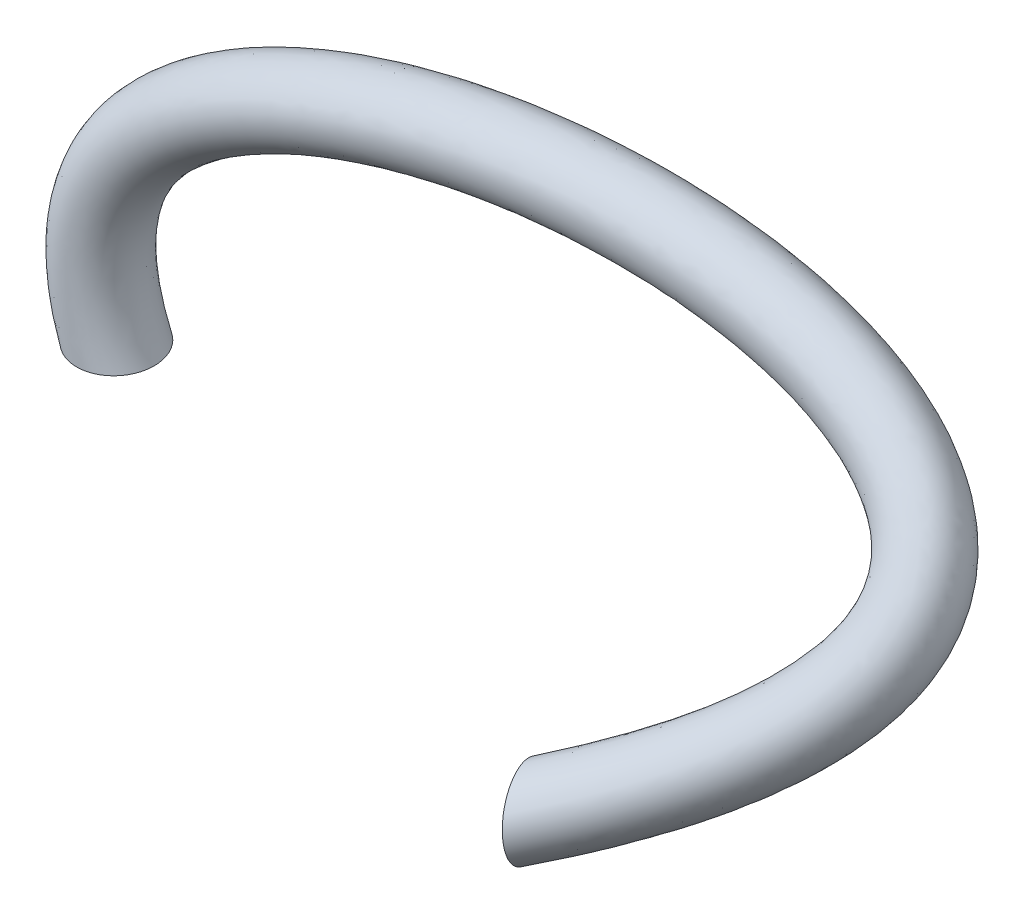
ISO-10303-21;
HEADER;
FILE_DESCRIPTION(('STEP AP214'),'2;1');
FILE_NAME('part.step','',(''),(''),'','','');
FILE_SCHEMA(('AUTOMOTIVE_DESIGN { 1 0 10303 214 1 1 1 1 }'));
ENDSEC;
DATA;
#1=APPLICATION_CONTEXT('core data for automotive mechanical design processes');
#2=APPLICATION_PROTOCOL_DEFINITION('international standard','automotive_design',2000,#1);
#3=PRODUCT_CONTEXT('',#1,'mechanical');
#4=PRODUCT('Part','Part','',(#3));
#5=PRODUCT_RELATED_PRODUCT_CATEGORY('part','',(#4));
#6=PRODUCT_DEFINITION_FORMATION('','',#4);
#7=PRODUCT_DEFINITION_CONTEXT('part definition',#1,'design');
#8=PRODUCT_DEFINITION('design','',#6,#7);
#9=PRODUCT_DEFINITION_SHAPE('','',#8);
#10=(LENGTH_UNIT() NAMED_UNIT(*) SI_UNIT(.MILLI.,.METRE.));
#11=(NAMED_UNIT(*) PLANE_ANGLE_UNIT() SI_UNIT($,.RADIAN.));
#12=(NAMED_UNIT(*) SI_UNIT($,.STERADIAN.) SOLID_ANGLE_UNIT());
#13=UNCERTAINTY_MEASURE_WITH_UNIT(LENGTH_MEASURE(1.E-05),#10,'distance_accuracy_value','');
#14=(GEOMETRIC_REPRESENTATION_CONTEXT(3) GLOBAL_UNCERTAINTY_ASSIGNED_CONTEXT((#13)) GLOBAL_UNIT_ASSIGNED_CONTEXT((#10,
#11,#12)) REPRESENTATION_CONTEXT('',''));
#15=CARTESIAN_POINT('',(0.,0.,0.));
#16=DIRECTION('',(0.,0.,1.));
#17=DIRECTION('',(1.,0.,0.));
#18=AXIS2_PLACEMENT_3D('',#15,#16,#17);
#19=CARTESIAN_POINT('',(-180.892438936026,508.3383657841,166.769335450842));
#20=DIRECTION('',(0.,0.998580485627212,0.0532636247782771));
#21=DIRECTION('',(0.,-0.0532636247782771,0.998580485627212));
#22=AXIS2_PLACEMENT_3D('',#19,#20,#21);
#23=PLANE('',#22);
#24=CARTESIAN_POINT('',(-180.892438936026,508.3383657841,166.769335450842));
#25=DIRECTION('',(0.,0.998580485627212,0.0532636247782771));
#26=DIRECTION('',(0.,-0.0532636247782771,0.998580485627212));
#27=AXIS2_PLACEMENT_3D('',#24,#25,#26);
#28=CIRCLE('',#27,31.75);
#29=CARTESIAN_POINT('',(-180.892438936026,506.64724569739,198.474265869506));
#30=VERTEX_POINT('',#29);
#31=EDGE_CURVE('E42',#30,#30,#28,.T.);
#32=ORIENTED_EDGE('',*,*,#31,.F.);
#33=EDGE_LOOP('',(#32));
#34=FACE_BOUND('',#33,.T.);
#35=ADVANCED_FACE('F35',(#34),#23,.F.);
#36=CARTESIAN_POINT('',(318.722561063977,520.715978156015,339.752092259281));
#37=DIRECTION('',(-0.935192391035048,-0.103787585891652,0.338590207721564));
#38=DIRECTION('',(0.253350720498909,0.471965138289844,0.844430175125056));
#39=AXIS2_PLACEMENT_3D('',#36,#37,#38);
#40=PLANE('',#39);
#41=CARTESIAN_POINT('',(318.722561063977,520.715978156015,339.752092259281));
#42=DIRECTION('',(-0.935192391035048,-0.103787585891652,0.338590207721564));
#43=DIRECTION('',(0.253350720498909,0.471965138289844,0.844430175125056));
#44=AXIS2_PLACEMENT_3D('',#41,#42,#43);
#45=CIRCLE('',#44,31.75);
#46=CARTESIAN_POINT('',(326.766446439817,535.700871296718,366.562750319502));
#47=VERTEX_POINT('',#46);
#48=EDGE_CURVE('E11',#47,#47,#45,.T.);
#49=ORIENTED_EDGE('',*,*,#48,.T.);
#50=EDGE_LOOP('',(#49));
#51=FACE_BOUND('',#50,.T.);
#52=ADVANCED_FACE('F49',(#51),#40,.T.);
#53=CARTESIAN_POINT('',(-180.892438936026,506.64724569739,198.474265869506));
#54=CARTESIAN_POINT('',(-185.397252018237,519.412265202046,199.029766488962));
#55=CARTESIAN_POINT('',(-188.556836614362,531.723481766009,199.396905932659));
#56=CARTESIAN_POINT('',(-192.350095416623,555.454756676039,199.792608728295));
#57=CARTESIAN_POINT('',(-192.983001318154,566.874985354525,199.821072955468));
#58=CARTESIAN_POINT('',(-191.889773397837,588.813417813292,199.578042889254));
#59=CARTESIAN_POINT('',(-190.16300648334,599.330714149347,199.30648533366));
#60=CARTESIAN_POINT('',(-184.545101376891,619.433300655065,198.505553824552));
#61=CARTESIAN_POINT('',(-180.654514563831,629.017526382448,197.976271505285));
#62=CARTESIAN_POINT('',(-170.935245991597,647.239815126233,196.705370538127));
#63=CARTESIAN_POINT('',(-165.107467504198,655.877937049715,195.963869840176));
#64=CARTESIAN_POINT('',(-151.745241570927,672.227908935097,194.31356064819));
#65=CARTESIAN_POINT('',(-144.211051911197,679.940356307442,193.404780553071));
#66=CARTESIAN_POINT('',(-127.652676418197,694.479800322714,191.462039028176));
#67=CARTESIAN_POINT('',(-118.628336632463,701.307182939554,190.428059341422));
#68=CARTESIAN_POINT('',(-99.2914676742567,714.121371751677,188.274209220244));
#69=CARTESIAN_POINT('',(-88.9787587814033,720.108314246159,187.154320655784));
#70=CARTESIAN_POINT('',(-56.3980859110481,736.870242885201,183.721523296127));
#71=CARTESIAN_POINT('',(-32.4883152849198,746.449778085621,181.336039001387));
#72=CARTESIAN_POINT('',(18.2059207608299,762.67693859375,176.650010824283));
#73=CARTESIAN_POINT('',(44.991264375501,769.326024046769,174.347920411729));
#74=CARTESIAN_POINT('',(99.9546895200575,779.826157244998,170.10485001691));
#75=CARTESIAN_POINT('',(128.133838622301,783.676393595046,168.161058986641));
#76=CARTESIAN_POINT('',(184.396415822009,788.56147085587,164.977960015783));
#77=CARTESIAN_POINT('',(212.480534995384,789.590828070617,163.739016099486));
#78=CARTESIAN_POINT('',(267.026841555992,788.759493038489,162.432504431816));
#79=CARTESIAN_POINT('',(293.487882458054,786.895764188656,162.369255358266));
#80=CARTESIAN_POINT('',(343.227507180928,780.306624674697,163.92576396104));
#81=CARTESIAN_POINT('',(366.504624438573,775.584774098288,165.54642051327));
#82=CARTESIAN_POINT('',(397.873331605955,766.452058060983,169.57748600854));
#83=CARTESIAN_POINT('',(407.738775801503,763.066501893392,171.187294372308));
#84=CARTESIAN_POINT('',(426.09688271056,755.623942346179,174.99374690735));
#85=CARTESIAN_POINT('',(434.58999036536,751.567053298695,177.19022897482));
#86=CARTESIAN_POINT('',(450.006051767202,742.783557101836,182.22949945234));
#87=CARTESIAN_POINT('',(456.929961922549,738.056442634249,185.072517532555));
#88=CARTESIAN_POINT('',(468.983007221103,727.927518915372,191.47062291914));
#89=CARTESIAN_POINT('',(474.112269322276,722.52383505786,195.027092772658));
#90=CARTESIAN_POINT('',(480.252709435279,713.929064903408,200.933596209099));
#91=CARTESIAN_POINT('',(482.040147943,710.983067194023,202.997428415167));
#92=CARTESIAN_POINT('',(485.060087598648,704.939381926195,207.315676297173));
#93=CARTESIAN_POINT('',(486.292449527001,701.841766862134,209.570055071003));
#94=CARTESIAN_POINT('',(488.169636791413,695.509933358706,214.265931323725));
#95=CARTESIAN_POINT('',(488.814410178947,692.275854524495,216.707328667875));
#96=CARTESIAN_POINT('',(489.490909682901,685.687470543548,221.771812963676));
#97=CARTESIAN_POINT('',(489.522707801123,682.333276924911,224.394804109165));
#98=CARTESIAN_POINT('',(488.670480281796,672.1106372044,232.530061453251));
#99=CARTESIAN_POINT('',(486.839203601875,665.08449192717,238.306731181469));
#100=CARTESIAN_POINT('',(480.528408732798,650.659367632931,250.574754033781));
#101=CARTESIAN_POINT('',(476.050105176211,643.258648949096,257.067272301776));
#102=CARTESIAN_POINT('',(464.301187316139,628.084663836457,270.816593189976));
#103=CARTESIAN_POINT('',(457.030076869348,620.310594500892,278.074088443846));
#104=CARTESIAN_POINT('',(439.518091333938,604.386490545052,293.410932909542));
#105=CARTESIAN_POINT('',(429.276766874824,596.236364047324,301.490421490199));
#106=CARTESIAN_POINT('',(393.810471549885,571.228593560118,327.042416079225));
#107=CARTESIAN_POINT('',(363.843025069143,553.811831019276,345.829796463944));
#108=CARTESIAN_POINT('',(326.766446439817,535.700871296718,366.562750319502));
#109=CARTESIAN_POINT('',(-117.392438936026,506.64724569739,198.474265869506));
#110=CARTESIAN_POINT('',(-121.897252018375,515.892165276404,199.181738392549));
#111=CARTESIAN_POINT('',(-125.350927404296,524.333655452845,199.742276256206));
#112=CARTESIAN_POINT('',(-130.658840628786,539.860816505287,200.64927979069));
#113=CARTESIAN_POINT('',(-132.522452285002,546.948485706512,200.996873664083));
#114=CARTESIAN_POINT('',(-134.985911307107,560.316906048854,201.533849961694));
#115=CARTESIAN_POINT('',(-135.588239492614,566.610841517048,201.723293370945));
#116=CARTESIAN_POINT('',(-135.456271321379,579.01969781485,201.949924230764));
#117=CARTESIAN_POINT('',(-134.71059731789,585.14351364447,201.985524335788));
#118=CARTESIAN_POINT('',(-131.533035782974,597.515696828623,201.884610247444));
#119=CARTESIAN_POINT('',(-129.09151789286,603.758837542345,201.747023811898));
#120=CARTESIAN_POINT('',(-122.277988821426,616.283041265219,201.302611125345));
#121=CARTESIAN_POINT('',(-117.906158374334,622.556313971452,200.996007393719));
#122=CARTESIAN_POINT('',(-107.245764214345,634.908063269333,200.252291725911));
#123=CARTESIAN_POINT('',(-100.960830371547,640.983302771348,199.815750879794));
#124=CARTESIAN_POINT('',(-86.6621657944391,652.741852905896,198.871163911559));
#125=CARTESIAN_POINT('',(-78.6510296861381,658.424996338971,198.363514009755));
#126=CARTESIAN_POINT('',(-52.4088922300789,674.708323919389,196.828430328104));
#127=CARTESIAN_POINT('',(-31.9767530300798,684.524919051601,195.794518242055));
#128=CARTESIAN_POINT('',(12.6543379897496,701.787874502303,194.1342690951));
#129=CARTESIAN_POINT('',(36.8511458529574,709.252559163575,193.510911274176));
#130=CARTESIAN_POINT('',(87.0726366472554,721.887495032437,192.896670179658));
#131=CARTESIAN_POINT('',(113.101340415207,727.066633331231,192.902252503942));
#132=CARTESIAN_POINT('',(165.183912780042,735.10600495555,193.546483050808));
#133=CARTESIAN_POINT('',(191.242553294898,737.959506149123,194.176788484128));
#134=CARTESIAN_POINT('',(241.570220774357,741.166154065291,196.050026671195));
#135=CARTESIAN_POINT('',(265.841278690591,741.501622784012,197.295855609671));
#136=CARTESIAN_POINT('',(310.650607817251,739.738648437046,200.501918908758));
#137=CARTESIAN_POINT('',(331.180698846945,737.621267831362,202.482070912833));
#138=CARTESIAN_POINT('',(357.65759291109,733.279282479662,205.906004707732));
#139=CARTESIAN_POINT('',(365.762383439444,731.645867964969,207.119184170643));
#140=CARTESIAN_POINT('',(380.33318836678,728.247953932869,209.585855762349));
#141=CARTESIAN_POINT('',(386.793715519667,726.48481177415,210.839217361164));
#142=CARTESIAN_POINT('',(398.029433353284,723.157950924879,213.199224489475));
#143=CARTESIAN_POINT('',(402.79712715453,721.603924588155,214.299582972664));
#144=CARTESIAN_POINT('',(410.965516940355,718.980473053233,216.152431931455));
#145=CARTESIAN_POINT('',(414.376746232151,717.931577391871,216.887800103995));
#146=CARTESIAN_POINT('',(419.026407561932,716.549506145655,217.830008999199));
#147=CARTESIAN_POINT('',(420.500842867497,716.113736749812,218.122253571663));
#148=CARTESIAN_POINT('',(423.362203443528,715.174096741192,218.752104004079));
#149=CARTESIAN_POINT('',(424.750264521306,714.668889717117,219.090574220705));
#150=CARTESIAN_POINT('',(427.43206933558,713.437120110833,219.938653386398));
#151=CARTESIAN_POINT('',(428.725525585322,712.708867021468,220.449599859115));
#152=CARTESIAN_POINT('',(431.122129793077,710.892076772848,221.76979338452));
#153=CARTESIAN_POINT('',(432.223749109749,709.802652725232,222.579940406784));
#154=CARTESIAN_POINT('',(435.009470689182,705.871217253582,225.595128050643));
#155=CARTESIAN_POINT('',(436.155256436171,702.343035882334,228.405579158595));
#156=CARTESIAN_POINT('',(435.834859045323,693.542639217399,235.789421980674));
#157=CARTESIAN_POINT('',(434.365824920449,688.293744647599,240.345317952946));
#158=CARTESIAN_POINT('',(428.188891067666,676.53665381773,250.97548564127));
#159=CARTESIAN_POINT('',(423.491789446793,670.034851538517,257.043195146025));
#160=CARTESIAN_POINT('',(410.635679853119,656.147637586163,270.471732878033));
#161=CARTESIAN_POINT('',(402.482415120971,648.761289132656,277.832366405219));
#162=CARTESIAN_POINT('',(372.66340878632,625.614641875442,301.660455340721));
#163=CARTESIAN_POINT('',(345.652557838964,608.887139865588,319.856296702227));
#164=CARTESIAN_POINT('',(311.053743324951,591.294279770428,340.20494511688));
#165=CARTESIAN_POINT('',(-117.392438936026,510.02948587081,135.064405032178));
#166=CARTESIAN_POINT('',(-121.558002559841,518.823151570187,135.747807970928));
#167=CARTESIAN_POINT('',(-124.687588443445,526.735867149019,136.287718807064));
#168=CARTESIAN_POINT('',(-129.438376441828,541.056818376766,137.168798165423));
#169=CARTESIAN_POINT('',(-131.070488986984,547.466711701158,137.511293139166));
#170=CARTESIAN_POINT('',(-133.218089277202,559.391929193884,138.06090365135));
#171=CARTESIAN_POINT('',(-133.737324030273,564.922252587504,138.26820670062));
#172=CARTESIAN_POINT('',(-133.586798638484,575.815472373315,138.553841889609));
#173=CARTESIAN_POINT('',(-132.904558089117,581.189392636739,138.630403415679));
#174=CARTESIAN_POINT('',(-129.938767489993,592.140961588719,138.628474362052));
#175=CARTESIAN_POINT('',(-127.643780535166,597.713265810835,138.548675638695));
#176=CARTESIAN_POINT('',(-121.135192435989,608.974468129036,138.231580786661));
#177=CARTESIAN_POINT('',(-116.921256446228,614.654381084224,137.99445037604));
#178=CARTESIAN_POINT('',(-106.545011774378,625.855716161275,137.401908118136));
#179=CARTESIAN_POINT('',(-100.386640863878,631.37312923777,137.047103872741));
#180=CARTESIAN_POINT('',(-86.2956761899943,642.001859346691,136.284372974725));
#181=CARTESIAN_POINT('',(-78.3660364935146,647.112736584057,135.876878805461));
#182=CARTESIAN_POINT('',(-52.3055141181946,661.592997484023,134.685533631688));
#183=CARTESIAN_POINT('',(-31.9091403524797,670.085628258293,133.93736330684));
#184=CARTESIAN_POINT('',(12.7103246507393,684.254508776572,133.081969722198));
#185=CARTESIAN_POINT('',(36.9295155236557,689.946162561166,132.980818760985));
#186=CARTESIAN_POINT('',(87.1009745756267,698.635355461125,133.769921633767));
#187=CARTESIAN_POINT('',(113.055128457219,701.643404446857,134.662263158486));
#188=CARTESIAN_POINT('',(164.752104756872,705.289841100345,137.430095282174));
#189=CARTESIAN_POINT('',(190.498316961639,705.932463995019,139.296515037514));
#190=CARTESIAN_POINT('',(239.898436755619,705.130116343571,143.736177128366));
#191=CARTESIAN_POINT('',(263.556668266892,703.673541016401,146.303678295444));
#192=CARTESIAN_POINT('',(306.840087791571,698.996713673528,151.901918382035));
#193=CARTESIAN_POINT('',(326.460028732923,695.75040395397,154.95077719499));
#194=CARTESIAN_POINT('',(351.32779460472,690.260715923497,159.622167923689));
#195=CARTESIAN_POINT('',(358.854818713461,688.335003934304,161.193019643486));
#196=CARTESIAN_POINT('',(372.179879878607,684.549935758474,164.23428743284));
#197=CARTESIAN_POINT('',(377.971539816728,682.691708271484,165.704897179596));
#198=CARTESIAN_POINT('',(387.784230113026,679.407935529071,168.324448498689));
#199=CARTESIAN_POINT('',(391.795850779241,677.993097261444,169.466643682513));
#200=CARTESIAN_POINT('',(398.426216352243,675.930510164083,171.181425454214));
#201=CARTESIAN_POINT('',(401.055240655913,675.307040083508,171.734124640466));
#202=CARTESIAN_POINT('',(404.634559323069,674.77087712051,172.224084099815));
#203=CARTESIAN_POINT('',(405.77030659285,674.650772664203,172.336475298029));
#204=CARTESIAN_POINT('',(408.014123683655,674.393845481067,172.557827988519));
#205=CARTESIAN_POINT('',(409.123607752178,674.255541353815,172.667727640457));
#206=CARTESIAN_POINT('',(411.324561220069,673.783697056967,173.027396371522));
#207=CARTESIAN_POINT('',(412.415847030229,673.448187173019,173.27870324462));
#208=CARTESIAN_POINT('',(414.486706006504,672.415158250608,174.069798618916));
#209=CARTESIAN_POINT('',(415.464606529379,671.716529266274,174.61067870359));
#210=CARTESIAN_POINT('',(417.980074565275,668.921694432336,176.831726356407));
#211=CARTESIAN_POINT('',(419.079486735914,666.098814699594,179.134725988564));
#212=CARTESIAN_POINT('',(418.788089079574,658.544892222771,185.615646050101));
#213=CARTESIAN_POINT('',(417.391998994661,653.840649521877,189.773740446945));
#214=CARTESIAN_POINT('',(411.381011542655,643.047437517465,199.705820544239));
#215=CARTESIAN_POINT('',(406.77790456528,636.966468002764,205.471858763764));
#216=CARTESIAN_POINT('',(394.094923313935,623.841605913743,218.364167548468));
#217=CARTESIAN_POINT('',(386.021691027954,616.79696030929,225.48996467836));
#218=CARTESIAN_POINT('',(356.411100020021,594.602251496575,248.679824957489));
#219=CARTESIAN_POINT('',(329.49725727937,578.415270071428,266.535863528357));
#220=CARTESIAN_POINT('',(294.965972573271,561.324493489023,286.583628996439));
#221=CARTESIAN_POINT('',(-180.892438936026,510.029485870811,135.064405032178));
#222=CARTESIAN_POINT('',(-185.058002560348,522.343251495829,135.595836067341));
#223=CARTESIAN_POINT('',(-187.893497653348,534.125693462509,135.942348483518));
#224=CARTESIAN_POINT('',(-191.129631229828,556.650758547194,136.312127103028));
#225=CARTESIAN_POINT('',(-191.531038020061,567.393211349171,136.335492430551));
#226=CARTESIAN_POINT('',(-190.121951368005,587.888440958321,136.10509657891));
#227=CARTESIAN_POINT('',(-188.312091021138,597.642125219803,135.851398663406));
#228=CARTESIAN_POINT('',(-182.675628693856,616.22907521353,135.109471483327));
#229=CARTESIAN_POINT('',(-178.848475334918,625.063405374439,134.621150585106));
#230=CARTESIAN_POINT('',(-169.340977698755,641.865079886608,133.449234652805));
#231=CARTESIAN_POINT('',(-163.659730146647,649.832365318492,132.765521666973));
#232=CARTESIAN_POINT('',(-150.602445185348,664.919335798628,131.242530309505));
#233=CARTESIAN_POINT('',(-143.226149983091,672.038423420214,130.403223535429));
#234=CARTESIAN_POINT('',(-126.95192397823,685.427453214657,128.611655420364));
#235=CARTESIAN_POINT('',(-118.054147124794,691.697009405659,127.659412334409));
#236=CARTESIAN_POINT('',(-98.9249780698118,703.38137819279,125.68741828337));
#237=CARTESIAN_POINT('',(-88.6937655887796,708.796054491245,124.667685451322));
#238=CARTESIAN_POINT('',(-56.2947077991637,723.754916449835,121.578626600047));
#239=CARTESIAN_POINT('',(-32.4207026073196,732.010487293048,119.47888406608));
#240=CARTESIAN_POINT('',(18.2619074218196,745.143572867285,115.597711451474));
#241=CARTESIAN_POINT('',(45.0696340454262,750.019627445134,113.817827898248));
#242=CARTESIAN_POINT('',(99.9830274492019,756.574017672913,110.978101471309));
#243=CARTESIAN_POINT('',(128.087626663533,758.253164710672,109.921069641087));
#244=CARTESIAN_POINT('',(183.96460779962,758.745307000665,108.861572247246));
#245=CARTESIAN_POINT('',(211.736298661374,757.56378591576,108.858742652873));
#246=CARTESIAN_POINT('',(265.355057538006,752.72345531752,110.118654888987));
#247=CARTESIAN_POINT('',(291.203272035735,749.067682420355,111.377078044126));
#248=CARTESIAN_POINT('',(339.416987153869,739.56468991187,115.325763434231));
#249=CARTESIAN_POINT('',(361.783954323353,733.713910220896,118.015126795576));
#250=CARTESIAN_POINT('',(391.543533300185,723.433491504818,123.293649224422));
#251=CARTESIAN_POINT('',(400.831211075383,719.755637863,125.261129845219));
#252=CARTESIAN_POINT('',(417.943574222523,711.925924171509,129.642178577773));
#253=CARTESIAN_POINT('',(425.767814662297,707.773949796276,132.055908793253));
#254=CARTESIAN_POINT('',(439.760848527067,699.03354170578,137.354723461554));
#255=CARTESIAN_POINT('',(445.928685547036,694.445615307312,140.239578242404));
#256=CARTESIAN_POINT('',(456.443706633217,684.877556026447,146.499616441899));
#257=CARTESIAN_POINT('',(460.790763746144,679.899297749496,149.873417309024));
#258=CARTESIAN_POINT('',(465.860861196363,672.150435878263,155.327671309768));
#259=CARTESIAN_POINT('',(467.3096116683,669.520103108623,157.211650141533));
#260=CARTESIAN_POINT('',(469.712007838828,664.15913066586,161.121400281613));
#261=CARTESIAN_POINT('',(470.665792758031,661.428418498832,163.147208490755));
#262=CARTESIAN_POINT('',(472.062128675744,655.85651030484,167.354674308848));
#263=CARTESIAN_POINT('',(472.504731623854,653.015174676046,169.53643205338));
#264=CARTESIAN_POINT('',(472.855485896328,647.210552021307,174.071818198071));
#265=CARTESIAN_POINT('',(472.76356522081,644.247153465953,176.425542405971));
#266=CARTESIAN_POINT('',(471.641084157774,635.161114383154,183.766659759016));
#267=CARTESIAN_POINT('',(469.763433901884,628.84027074443,189.035878011371));
#268=CARTESIAN_POINT('',(463.481638766782,615.661620638303,200.400978103275));
#269=CARTESIAN_POINT('',(459.076279250583,608.805553823694,206.495694795775));
#270=CARTESIAN_POINT('',(447.493307790968,594.595447535872,219.546928092945));
#271=CARTESIAN_POINT('',(440.316191987642,587.242210965139,226.502752060814));
#272=CARTESIAN_POINT('',(422.977334794946,572.080458872632,241.303367580748));
#273=CARTESIAN_POINT('',(412.816042781807,564.27203522442,249.148019762879));
#274=CARTESIAN_POINT('',(377.558162783585,540.216203180328,274.061785696915));
#275=CARTESIAN_POINT('',(347.687724511464,523.339961219373,292.509363291988));
#276=CARTESIAN_POINT('',(310.678675688136,505.731085015313,312.941434199061));
#277=CARTESIAN_POINT('',(-244.392438936026,510.029485870811,135.064405032178));
#278=CARTESIAN_POINT('',(-248.558002560854,525.863351421472,135.443864163755));
#279=CARTESIAN_POINT('',(-251.099406863252,541.515519775998,135.596978159971));
#280=CARTESIAN_POINT('',(-252.820886017828,572.244698717621,135.455456040633));
#281=CARTESIAN_POINT('',(-251.991587053139,587.319710997183,135.159691721936));
#282=CARTESIAN_POINT('',(-247.025813458809,616.384952722759,134.149289506469));
#283=CARTESIAN_POINT('',(-242.886858012004,630.361997852102,133.434590626191));
#284=CARTESIAN_POINT('',(-231.764458749227,656.642678053744,131.665101077046));
#285=CARTESIAN_POINT('',(-224.792392580719,668.937418112139,130.611897754533));
#286=CARTESIAN_POINT('',(-208.743187907516,691.589198184496,128.269994943557));
#287=CARTESIAN_POINT('',(-199.675679758127,701.951464826148,126.982367695251));
#288=CARTESIAN_POINT('',(-180.069697934706,720.864203468221,124.25347983235));
#289=CARTESIAN_POINT('',(-169.531043519954,729.422465756203,122.811996694819));
#290=CARTESIAN_POINT('',(-147.358836182081,744.999190268039,119.821402722591));
#291=CARTESIAN_POINT('',(-135.72165338571,752.020889573547,118.271720796076));
#292=CARTESIAN_POINT('',(-111.554279949629,764.760897038888,115.090463592016));
#293=CARTESIAN_POINT('',(-99.0214946840446,770.479372398433,113.458492097183));
#294=CARTESIAN_POINT('',(-60.2839014801328,785.916835415648,108.471719568406));
#295=CARTESIAN_POINT('',(-32.9322648621595,793.935346327803,105.02040482532));
#296=CARTESIAN_POINT('',(23.8134901929,806.032636957998,98.1134531807499));
#297=CARTESIAN_POINT('',(53.2097525671968,810.093092329101,94.6548370355107));
#298=CARTESIAN_POINT('',(112.865080322777,814.512679884701,88.1862813088503));
#299=CARTESIAN_POINT('',(143.120124869847,814.862924974486,85.1798761236885));
#300=CARTESIAN_POINT('',(203.177110842367,812.200772900987,80.2930492123181));
#301=CARTESIAN_POINT('',(232.974280361109,809.195107836502,78.4209702682314));
#302=CARTESIAN_POINT('',(290.811678320394,800.316794291469,76.5011326496077));
#303=CARTESIAN_POINT('',(318.849875804578,794.461823824309,76.4504777928075));
#304=CARTESIAN_POINT('',(371.993886516167,780.132666150211,78.7496084864272));
#305=CARTESIAN_POINT('',(397.107879913782,771.677416487822,81.0794763961625));
#306=CARTESIAN_POINT('',(431.759271995649,756.606267086138,86.9651305251556));
#307=CARTESIAN_POINT('',(442.807603437306,751.176271791697,89.3292400469519));
#308=CARTESIAN_POINT('',(463.70726856644,739.301912584545,95.0500697227052));
#309=CARTESIAN_POINT('',(473.564089507866,732.856191321069,98.406920406909));
#310=CARTESIAN_POINT('',(491.737466941109,718.659147882489,106.384998424419));
#311=CARTESIAN_POINT('',(500.06152031483,710.898133353181,111.012512802295));
#312=CARTESIAN_POINT('',(514.461196914191,693.824601888811,121.817807429584));
#313=CARTESIAN_POINT('',(520.526286836375,684.491555415485,128.012709977581));
#314=CARTESIAN_POINT('',(527.087163069658,669.529994636016,138.431258519721));
#315=CARTESIAN_POINT('',(528.848916743751,664.389433553043,142.086824985037));
#316=CARTESIAN_POINT('',(531.409891994,653.924415850653,149.684972574707));
#317=CARTESIAN_POINT('',(532.207977763885,648.601295643848,153.626689341053));
#318=CARTESIAN_POINT('',(532.799696131418,637.929323552712,161.681952246174));
#319=CARTESIAN_POINT('',(532.59361621748,632.582162179074,165.794160862141));
#320=CARTESIAN_POINT('',(531.224265786153,622.005945792006,174.073837777227));
#321=CARTESIAN_POINT('',(530.062523912241,616.777777665633,178.240406108353));
#322=CARTESIAN_POINT('',(525.302093750273,601.400534333971,190.701593161624));
#323=CARTESIAN_POINT('',(520.447381067854,591.581726789266,198.937030034179));
#324=CARTESIAN_POINT('',(508.175188453991,572.778349053835,215.186310156449));
#325=CARTESIAN_POINT('',(500.760559506505,563.770458125511,223.217649144605));
#326=CARTESIAN_POINT('',(483.605604039281,546.143457554279,239.38803564165));
#327=CARTESIAN_POINT('',(473.854479410005,537.517953927515,247.533645357865));
#328=CARTESIAN_POINT('',(451.859746275958,520.319311831521,264.242567613028));
#329=CARTESIAN_POINT('',(439.61039453566,511.74711013955,272.806074847398));
#330=CARTESIAN_POINT('',(398.70522554715,485.830154864081,299.443746436342));
#331=CARTESIAN_POINT('',(365.878191743556,468.264652367317,318.482863055619));
#332=CARTESIAN_POINT('',(326.391378803001,450.137676541603,339.299239401682));
#333=CARTESIAN_POINT('',(-244.392438936026,506.64724569739,198.474265869506));
#334=CARTESIAN_POINT('',(-248.897252018098,522.932365127688,198.877794585376));
#335=CARTESIAN_POINT('',(-251.762745824428,539.113308079174,199.051535609113));
#336=CARTESIAN_POINT('',(-254.041350204461,571.048696846791,198.935937665901));
#337=CARTESIAN_POINT('',(-253.443550351305,586.801485002537,198.645272246853));
#338=CARTESIAN_POINT('',(-248.793635488567,617.309929577729,197.622235816813));
#339=CARTESIAN_POINT('',(-244.737773474066,632.050586781646,196.889677296376));
#340=CARTESIAN_POINT('',(-233.633931432403,659.846903495279,195.061183418341));
#341=CARTESIAN_POINT('',(-226.598431809771,672.891539120426,193.967018674781));
#342=CARTESIAN_POINT('',(-210.337456200219,696.963933423844,191.52613082881));
#343=CARTESIAN_POINT('',(-201.123417115535,707.997036557086,190.180715868454));
#344=CARTESIAN_POINT('',(-181.212494320428,728.172776604975,187.324510171034));
#345=CARTESIAN_POINT('',(-170.51594544806,737.324398643431,185.813553712423));
#346=CARTESIAN_POINT('',(-148.059588622049,754.051537376097,182.671786330441));
#347=CARTESIAN_POINT('',(-136.295842893379,761.631063107761,181.04036780305));
#348=CARTESIAN_POINT('',(-111.920769554074,775.500890597458,177.67725452893));
#349=CARTESIAN_POINT('',(-99.3064878766684,781.791632153347,175.945127301813));
#350=CARTESIAN_POINT('',(-60.3872795920172,799.032161851014,170.61461626415));
#351=CARTESIAN_POINT('',(-32.9998775397599,808.374637119641,166.877559760719));
#352=CARTESIAN_POINT('',(23.7575035319101,823.566002685198,159.165752553468));
#353=CARTESIAN_POINT('',(53.1313828980445,829.399488929964,155.184929549281));
#354=CARTESIAN_POINT('',(112.836742392859,837.764819457559,147.313029854162));
#355=CARTESIAN_POINT('',(143.166336829395,840.286153858861,143.419865469339));
#356=CARTESIAN_POINT('',(203.608918863977,842.016936756192,136.409436980758));
#357=CARTESIAN_POINT('',(233.718516695871,841.22214999211,133.301243714845));
#358=CARTESIAN_POINT('',(292.483462337628,836.352832011687,128.814982192437));
#359=CARTESIAN_POINT('',(321.134486225517,832.2899055933,127.442655106861));
#360=CARTESIAN_POINT('',(375.804406544606,820.874600912349,127.349609013322));
#361=CARTESIAN_POINT('',(401.828550030202,813.548280365215,128.610770113706));
#362=CARTESIAN_POINT('',(438.08907030082,799.624833642304,133.248967309348));
#363=CARTESIAN_POINT('',(449.715168163562,794.487135821815,135.255404573972));
#364=CARTESIAN_POINT('',(471.86057705434,782.999930759488,140.401638052351));
#365=CARTESIAN_POINT('',(482.386265211053,776.649294823239,143.541240588477));
#366=CARTESIAN_POINT('',(501.98267018112,762.409163278793,151.259774415206));
#367=CARTESIAN_POINT('',(511.062796690569,754.508960680344,155.845452092446));
#368=CARTESIAN_POINT('',(527.000497501852,736.87456477751,166.788813906825));
#369=CARTESIAN_POINT('',(533.847792412401,727.116092723849,173.166385441321));
#370=CARTESIAN_POINT('',(541.479011308626,711.308623661161,184.037183418998));
#371=CARTESIAN_POINT('',(543.579453018502,705.852397638234,187.87260325867));
#372=CARTESIAN_POINT('',(546.757971753768,694.704667111197,195.879248590267));
#373=CARTESIAN_POINT('',(547.834634532696,689.014644007151,200.0495359213));
#374=CARTESIAN_POINT('',(548.907204247246,677.582746606579,208.593209261051));
#375=CARTESIAN_POINT('',(548.903294772573,671.842842027523,212.965057476635));
#376=CARTESIAN_POINT('',(547.859689572725,660.482864314247,221.773832542831));
#377=CARTESIAN_POINT('',(546.821666492496,654.863901124591,226.209667811546));
#378=CARTESIAN_POINT('',(542.331489874409,638.350057155218,239.46499485586));
#379=CARTESIAN_POINT('',(537.523150767577,627.825947972006,248.207883204343));
#380=CARTESIAN_POINT('',(525.221958420274,607.776096048464,265.360086086888));
#381=CARTESIAN_POINT('',(517.734385431973,598.223553250593,273.789226650605));
#382=CARTESIAN_POINT('',(500.413483564613,579.632673855185,290.657700738681));
#383=CARTESIAN_POINT('',(490.568364291903,570.586337463267,299.104981741668));
#384=CARTESIAN_POINT('',(468.400502814757,552.62534350394,316.35013294105));
#385=CARTESIAN_POINT('',(456.071118628678,543.711438961993,325.14847657518));
#386=CARTESIAN_POINT('',(414.957534313449,516.842545244794,352.424376817728));
#387=CARTESIAN_POINT('',(382.033492299321,498.736522172965,371.803296225661));
#388=CARTESIAN_POINT('',(342.479149554682,480.107462823008,392.920555522123));
#389=CARTESIAN_POINT('',(-180.892438936026,506.64724569739,198.474265869506));
#390=CARTESIAN_POINT('',(-185.397252018237,519.412265202046,199.029766488962));
#391=CARTESIAN_POINT('',(-188.556836614362,531.723481766009,199.396905932659));
#392=CARTESIAN_POINT('',(-192.350095416623,555.454756676039,199.792608728295));
#393=CARTESIAN_POINT('',(-192.983001318154,566.874985354525,199.821072955468));
#394=CARTESIAN_POINT('',(-191.889773397837,588.813417813292,199.578042889254));
#395=CARTESIAN_POINT('',(-190.16300648334,599.330714149347,199.30648533366));
#396=CARTESIAN_POINT('',(-184.545101376891,619.433300655065,198.505553824552));
#397=CARTESIAN_POINT('',(-180.654514563831,629.017526382448,197.976271505285));
#398=CARTESIAN_POINT('',(-170.935245991597,647.239815126233,196.705370538127));
#399=CARTESIAN_POINT('',(-165.107467504198,655.877937049715,195.963869840176));
#400=CARTESIAN_POINT('',(-151.745241570927,672.227908935097,194.31356064819));
#401=CARTESIAN_POINT('',(-144.211051911197,679.940356307442,193.404780553071));
#402=CARTESIAN_POINT('',(-127.652676418197,694.479800322714,191.462039028176));
#403=CARTESIAN_POINT('',(-118.628336632463,701.307182939554,190.428059341422));
#404=CARTESIAN_POINT('',(-99.2914676742567,714.121371751677,188.274209220244));
#405=CARTESIAN_POINT('',(-88.9787587814033,720.108314246159,187.154320655784));
#406=CARTESIAN_POINT('',(-56.3980859110481,736.870242885201,183.721523296127));
#407=CARTESIAN_POINT('',(-32.4883152849198,746.449778085621,181.336039001387));
#408=CARTESIAN_POINT('',(18.2059207608299,762.67693859375,176.650010824283));
#409=CARTESIAN_POINT('',(44.991264375501,769.326024046769,174.347920411729));
#410=CARTESIAN_POINT('',(99.9546895200575,779.826157244998,170.10485001691));
#411=CARTESIAN_POINT('',(128.133838622301,783.676393595046,168.161058986641));
#412=CARTESIAN_POINT('',(184.396415822009,788.56147085587,164.977960015783));
#413=CARTESIAN_POINT('',(212.480534995384,789.590828070617,163.739016099486));
#414=CARTESIAN_POINT('',(267.026841555992,788.759493038489,162.432504431816));
#415=CARTESIAN_POINT('',(293.487882458054,786.895764188656,162.369255358266));
#416=CARTESIAN_POINT('',(343.227507180928,780.306624674697,163.92576396104));
#417=CARTESIAN_POINT('',(366.504624438573,775.584774098288,165.54642051327));
#418=CARTESIAN_POINT('',(397.873331605955,766.452058060983,169.57748600854));
#419=CARTESIAN_POINT('',(407.738775801503,763.066501893392,171.187294372308));
#420=CARTESIAN_POINT('',(426.09688271056,755.623942346179,174.99374690735));
#421=CARTESIAN_POINT('',(434.58999036536,751.567053298695,177.19022897482));
#422=CARTESIAN_POINT('',(450.006051767202,742.783557101836,182.22949945234));
#423=CARTESIAN_POINT('',(456.929961922549,738.056442634249,185.072517532555));
#424=CARTESIAN_POINT('',(468.983007221103,727.927518915372,191.47062291914));
#425=CARTESIAN_POINT('',(474.112269322276,722.52383505786,195.027092772658));
#426=CARTESIAN_POINT('',(480.252709435279,713.929064903408,200.933596209099));
#427=CARTESIAN_POINT('',(482.040147943,710.983067194023,202.997428415167));
#428=CARTESIAN_POINT('',(485.060087598648,704.939381926195,207.315676297173));
#429=CARTESIAN_POINT('',(486.292449527001,701.841766862134,209.570055071003));
#430=CARTESIAN_POINT('',(488.169636791413,695.509933358706,214.265931323725));
#431=CARTESIAN_POINT('',(488.814410178947,692.275854524495,216.707328667875));
#432=CARTESIAN_POINT('',(489.490909682901,685.687470543548,221.771812963676));
#433=CARTESIAN_POINT('',(489.522707801123,682.333276924911,224.394804109165));
#434=CARTESIAN_POINT('',(488.670480281796,672.1106372044,232.530061453251));
#435=CARTESIAN_POINT('',(486.839203601875,665.08449192717,238.306731181469));
#436=CARTESIAN_POINT('',(480.528408732798,650.659367632931,250.574754033781));
#437=CARTESIAN_POINT('',(476.050105176211,643.258648949096,257.067272301776));
#438=CARTESIAN_POINT('',(464.301187316139,628.084663836457,270.816593189976));
#439=CARTESIAN_POINT('',(457.030076869348,620.310594500892,278.074088443846));
#440=CARTESIAN_POINT('',(439.518091333938,604.386490545052,293.410932909542));
#441=CARTESIAN_POINT('',(429.276766874824,596.236364047324,301.490421490199));
#442=CARTESIAN_POINT('',(393.810471549885,571.228593560118,327.042416079225));
#443=CARTESIAN_POINT('',(363.843025069143,553.811831019276,345.829796463944));
#444=CARTESIAN_POINT('',(326.766446439817,535.700871296718,366.562750319502));
#445=(BOUNDED_SURFACE() B_SPLINE_SURFACE(3,3,((#53,#54,#55,#56,#57,#58,#59,#60,#61,#62,#63,#64,
#65,#66,#67,#68,#69,#70,#71,#72,#73,#74,#75,#76,#77,#78,#79,#80,#81,#82,#83,#84,#85,#86,#87,#88,
#89,#90,#91,#92,#93,#94,#95,#96,#97,#98,#99,#100,#101,#102,#103,#104,#105,#106,#107,#108),(#109,
#110,#111,#112,#113,#114,#115,#116,#117,#118,#119,#120,#121,#122,#123,#124,#125,#126,#127,#128,
#129,#130,#131,#132,#133,#134,#135,#136,#137,#138,#139,#140,#141,#142,#143,#144,#145,#146,#147,
#148,#149,#150,#151,#152,#153,#154,#155,#156,#157,#158,#159,#160,#161,#162,#163,#164),(#165,
#166,#167,#168,#169,#170,#171,#172,#173,#174,#175,#176,#177,#178,#179,#180,#181,#182,#183,#184,
#185,#186,#187,#188,#189,#190,#191,#192,#193,#194,#195,#196,#197,#198,#199,#200,#201,#202,#203,
#204,#205,#206,#207,#208,#209,#210,#211,#212,#213,#214,#215,#216,#217,#218,#219,#220),(#221,
#222,#223,#224,#225,#226,#227,#228,#229,#230,#231,#232,#233,#234,#235,#236,#237,#238,#239,#240,
#241,#242,#243,#244,#245,#246,#247,#248,#249,#250,#251,#252,#253,#254,#255,#256,#257,#258,#259,
#260,#261,#262,#263,#264,#265,#266,#267,#268,#269,#270,#271,#272,#273,#274,#275,#276),(#277,
#278,#279,#280,#281,#282,#283,#284,#285,#286,#287,#288,#289,#290,#291,#292,#293,#294,#295,#296,
#297,#298,#299,#300,#301,#302,#303,#304,#305,#306,#307,#308,#309,#310,#311,#312,#313,#314,#315,
#316,#317,#318,#319,#320,#321,#322,#323,#324,#325,#326,#327,#328,#329,#330,#331,#332),(#333,
#334,#335,#336,#337,#338,#339,#340,#341,#342,#343,#344,#345,#346,#347,#348,#349,#350,#351,#352,
#353,#354,#355,#356,#357,#358,#359,#360,#361,#362,#363,#364,#365,#366,#367,#368,#369,#370,#371,
#372,#373,#374,#375,#376,#377,#378,#379,#380,#381,#382,#383,#384,#385,#386,#387,#388),(#389,
#390,#391,#392,#393,#394,#395,#396,#397,#398,#399,#400,#401,#402,#403,#404,#405,#406,#407,#408,
#409,#410,#411,#412,#413,#414,#415,#416,#417,#418,#419,#420,#421,#422,#423,#424,#425,#426,#427,
#428,#429,#430,#431,#432,#433,#434,#435,#436,#437,#438,#439,#440,#441,#442,#443,#444)),
.UNSPECIFIED.,.T.,.F.,.F.) B_SPLINE_SURFACE_WITH_KNOTS((4,3,4),(4,2,2,2,2,2,2,2,2,2,2,2,2,2,2,2,
2,2,2,2,2,2,2,2,2,2,2,4),(0.,0.5,1.),(0.,0.03125,0.0625,0.09375,0.125,0.15625,0.1875,0.21875,
0.25,0.3125,0.375,0.4375,0.5,0.5625,0.625,0.65625,0.6875,0.71875,0.75,0.765625,0.78125,0.796875,
0.8125,0.84375,0.875,0.90625,0.9375,1.),
.UNSPECIFIED.) GEOMETRIC_REPRESENTATION_ITEM() RATIONAL_B_SPLINE_SURFACE(((1.,1.,1.,1.,1.,1.,1.,
1.,1.,1.,1.,1.,1.,1.,1.,1.,1.,1.,1.,1.,1.,1.,1.,1.,1.,1.,1.,1.,1.,1.,1.,1.,1.,1.,1.,1.,1.,1.,1.,
1.,1.,1.,1.,1.,1.,1.,1.,1.,1.,1.,1.,1.,1.,1.,1.,1.),(0.333333333333333,0.333333333333333,
0.333333333333333,0.333333333333333,0.333333333333333,0.333333333333333,0.333333333333333,
0.333333333333333,0.333333333333333,0.333333333333333,0.333333333333333,0.333333333333333,
0.333333333333333,0.333333333333333,0.333333333333333,0.333333333333333,0.333333333333333,
0.333333333333333,0.333333333333333,0.333333333333333,0.333333333333333,0.333333333333333,
0.333333333333333,0.333333333333333,0.333333333333333,0.333333333333333,0.333333333333333,
0.333333333333333,0.333333333333333,0.333333333333333,0.333333333333333,0.333333333333333,
0.333333333333333,0.333333333333333,0.333333333333333,0.333333333333333,0.333333333333333,
0.333333333333333,0.333333333333333,0.333333333333333,0.333333333333333,0.333333333333333,
0.333333333333333,0.333333333333333,0.333333333333333,0.333333333333333,0.333333333333333,
0.333333333333333,0.333333333333333,0.333333333333333,0.333333333333333,0.333333333333333,
0.333333333333333,0.333333333333333,0.333333333333333,0.333333333333333),(0.333333333333333,
0.333333333333333,0.333333333333333,0.333333333333333,0.333333333333333,0.333333333333333,
0.333333333333333,0.333333333333333,0.333333333333333,0.333333333333333,0.333333333333333,
0.333333333333333,0.333333333333333,0.333333333333333,0.333333333333333,0.333333333333333,
0.333333333333333,0.333333333333333,0.333333333333333,0.333333333333333,0.333333333333333,
0.333333333333333,0.333333333333333,0.333333333333333,0.333333333333333,0.333333333333333,
0.333333333333333,0.333333333333333,0.333333333333333,0.333333333333333,0.333333333333333,
0.333333333333333,0.333333333333333,0.333333333333333,0.333333333333333,0.333333333333333,
0.333333333333333,0.333333333333333,0.333333333333333,0.333333333333333,0.333333333333333,
0.333333333333333,0.333333333333333,0.333333333333333,0.333333333333333,0.333333333333333,
0.333333333333333,0.333333333333333,0.333333333333333,0.333333333333333,0.333333333333333,
0.333333333333333,0.333333333333333,0.333333333333333,0.333333333333333,0.333333333333333),(1.,
1.,1.,1.,1.,1.,1.,1.,1.,1.,1.,1.,1.,1.,1.,1.,1.,1.,1.,1.,1.,1.,1.,1.,1.,1.,1.,1.,1.,1.,1.,1.,1.,
1.,1.,1.,1.,1.,1.,1.,1.,1.,1.,1.,1.,1.,1.,1.,1.,1.,1.,1.,1.,1.,1.,1.),(0.333333333333333,
0.333333333333333,0.333333333333333,0.333333333333333,0.333333333333333,0.333333333333333,
0.333333333333333,0.333333333333333,0.333333333333333,0.333333333333333,0.333333333333333,
0.333333333333333,0.333333333333333,0.333333333333333,0.333333333333333,0.333333333333333,
0.333333333333333,0.333333333333333,0.333333333333333,0.333333333333333,0.333333333333333,
0.333333333333333,0.333333333333333,0.333333333333333,0.333333333333333,0.333333333333333,
0.333333333333333,0.333333333333333,0.333333333333333,0.333333333333333,0.333333333333333,
0.333333333333333,0.333333333333333,0.333333333333333,0.333333333333333,0.333333333333333,
0.333333333333333,0.333333333333333,0.333333333333333,0.333333333333333,0.333333333333333,
0.333333333333333,0.333333333333333,0.333333333333333,0.333333333333333,0.333333333333333,
0.333333333333333,0.333333333333333,0.333333333333333,0.333333333333333,0.333333333333333,
0.333333333333333,0.333333333333333,0.333333333333333,0.333333333333333,0.333333333333333),
(0.333333333333333,0.333333333333333,0.333333333333333,0.333333333333333,0.333333333333333,
0.333333333333333,0.333333333333333,0.333333333333333,0.333333333333333,0.333333333333333,
0.333333333333333,0.333333333333333,0.333333333333333,0.333333333333333,0.333333333333333,
0.333333333333333,0.333333333333333,0.333333333333333,0.333333333333333,0.333333333333333,
0.333333333333333,0.333333333333333,0.333333333333333,0.333333333333333,0.333333333333333,
0.333333333333333,0.333333333333333,0.333333333333333,0.333333333333333,0.333333333333333,
0.333333333333333,0.333333333333333,0.333333333333333,0.333333333333333,0.333333333333333,
0.333333333333333,0.333333333333333,0.333333333333333,0.333333333333333,0.333333333333333,
0.333333333333333,0.333333333333333,0.333333333333333,0.333333333333333,0.333333333333333,
0.333333333333333,0.333333333333333,0.333333333333333,0.333333333333333,0.333333333333333,
0.333333333333333,0.333333333333333,0.333333333333333,0.333333333333333,0.333333333333333,
0.333333333333333),(1.,1.,1.,1.,1.,1.,1.,1.,1.,1.,1.,1.,1.,1.,1.,1.,1.,1.,1.,1.,1.,1.,1.,1.,1.,
1.,1.,1.,1.,1.,1.,1.,1.,1.,1.,1.,1.,1.,1.,1.,1.,1.,1.,1.,1.,1.,1.,1.,1.,1.,1.,1.,1.,1.,1.,1.))) REPRESENTATION_ITEM('') SURFACE());
#446=ORIENTED_EDGE('',*,*,#48,.F.);
#447=EDGE_LOOP('',(#446));
#448=FACE_BOUND('',#447,.T.);
#449=ORIENTED_EDGE('',*,*,#31,.T.);
#450=EDGE_LOOP('',(#449));
#451=FACE_BOUND('',#450,.T.);
#452=ADVANCED_FACE('F51',(#448,#451),#445,.T.);
#453=CLOSED_SHELL('',(#35,#52,#452));
#454=MANIFOLD_SOLID_BREP('B2',#453);
#455=ADVANCED_BREP_SHAPE_REPRESENTATION('',(#18,#454),#14);
#456=SHAPE_DEFINITION_REPRESENTATION(#9,#455);
ENDSEC;
END-ISO-10303-21;
